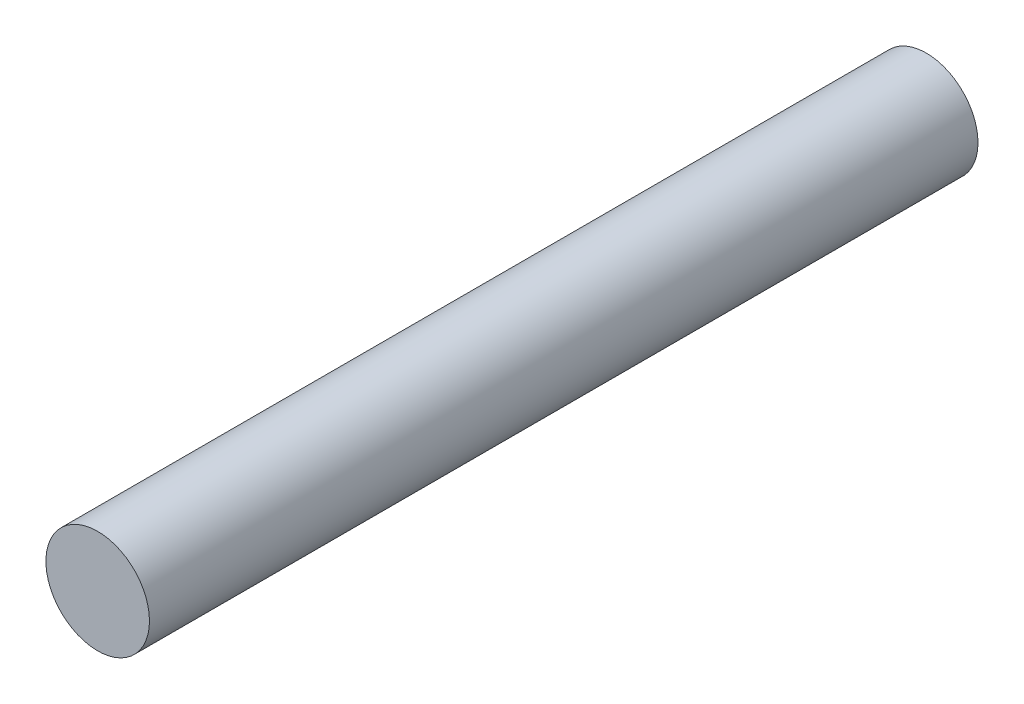
ISO-10303-21;
HEADER;
FILE_DESCRIPTION(('STEP AP214'),'2;1');
FILE_NAME('part.step','',(''),(''),'','','');
FILE_SCHEMA(('AUTOMOTIVE_DESIGN { 1 0 10303 214 1 1 1 1 }'));
ENDSEC;
DATA;
#1=APPLICATION_CONTEXT('core data for automotive mechanical design processes');
#2=APPLICATION_PROTOCOL_DEFINITION('international standard','automotive_design',2000,#1);
#3=PRODUCT_CONTEXT('',#1,'mechanical');
#4=PRODUCT('Part','Part','',(#3));
#5=PRODUCT_RELATED_PRODUCT_CATEGORY('part','',(#4));
#6=PRODUCT_DEFINITION_FORMATION('','',#4);
#7=PRODUCT_DEFINITION_CONTEXT('part definition',#1,'design');
#8=PRODUCT_DEFINITION('design','',#6,#7);
#9=PRODUCT_DEFINITION_SHAPE('','',#8);
#10=(LENGTH_UNIT() NAMED_UNIT(*) SI_UNIT(.MILLI.,.METRE.));
#11=(NAMED_UNIT(*) PLANE_ANGLE_UNIT() SI_UNIT($,.RADIAN.));
#12=(NAMED_UNIT(*) SI_UNIT($,.STERADIAN.) SOLID_ANGLE_UNIT());
#13=UNCERTAINTY_MEASURE_WITH_UNIT(LENGTH_MEASURE(1.E-05),#10,'distance_accuracy_value','');
#14=(GEOMETRIC_REPRESENTATION_CONTEXT(3) GLOBAL_UNCERTAINTY_ASSIGNED_CONTEXT((#13)) GLOBAL_UNIT_ASSIGNED_CONTEXT((#10,
#11,#12)) REPRESENTATION_CONTEXT('',''));
#15=CARTESIAN_POINT('',(0.,0.,0.));
#16=DIRECTION('',(0.,0.,1.));
#17=DIRECTION('',(1.,0.,0.));
#18=AXIS2_PLACEMENT_3D('',#15,#16,#17);
#19=CARTESIAN_POINT('',(0.,0.,40.));
#20=DIRECTION('',(0.,0.,-1.));
#21=DIRECTION('',(-1.,0.,0.));
#22=AXIS2_PLACEMENT_3D('',#19,#20,#21);
#23=CYLINDRICAL_SURFACE('',#22,2.5);
#24=CARTESIAN_POINT('',(0.,0.,40.));
#25=DIRECTION('',(0.,0.,1.));
#26=DIRECTION('',(1.,0.,0.));
#27=AXIS2_PLACEMENT_3D('',#24,#25,#26);
#28=CIRCLE('',#27,2.5);
#29=CARTESIAN_POINT('',(2.5,0.,40.));
#30=VERTEX_POINT('',#29);
#31=EDGE_CURVE('E10',#30,#30,#28,.T.);
#32=ORIENTED_EDGE('',*,*,#31,.F.);
#33=EDGE_LOOP('',(#32));
#34=FACE_BOUND('',#33,.T.);
#35=CARTESIAN_POINT('',(0.,0.,0.));
#36=DIRECTION('',(0.,0.,1.));
#37=DIRECTION('',(1.,0.,0.));
#38=AXIS2_PLACEMENT_3D('',#35,#36,#37);
#39=CIRCLE('',#38,2.5);
#40=CARTESIAN_POINT('',(2.5,0.,0.));
#41=VERTEX_POINT('',#40);
#42=EDGE_CURVE('E40',#41,#41,#39,.T.);
#43=ORIENTED_EDGE('',*,*,#42,.T.);
#44=EDGE_LOOP('',(#43));
#45=FACE_BOUND('',#44,.T.);
#46=ADVANCED_FACE('F37',(#34,#45),#23,.T.);
#47=CARTESIAN_POINT('',(0.,0.,40.));
#48=DIRECTION('',(0.,0.,1.));
#49=DIRECTION('',(1.,0.,0.));
#50=AXIS2_PLACEMENT_3D('',#47,#48,#49);
#51=PLANE('',#50);
#52=ORIENTED_EDGE('',*,*,#31,.T.);
#53=EDGE_LOOP('',(#52));
#54=FACE_BOUND('',#53,.T.);
#55=ADVANCED_FACE('F52',(#54),#51,.T.);
#56=CARTESIAN_POINT('',(0.,0.,0.));
#57=DIRECTION('',(0.,0.,1.));
#58=DIRECTION('',(1.,0.,0.));
#59=AXIS2_PLACEMENT_3D('',#56,#57,#58);
#60=PLANE('',#59);
#61=ORIENTED_EDGE('',*,*,#42,.F.);
#62=EDGE_LOOP('',(#61));
#63=FACE_BOUND('',#62,.T.);
#64=ADVANCED_FACE('F50',(#63),#60,.F.);
#65=CLOSED_SHELL('',(#46,#55,#64));
#66=MANIFOLD_SOLID_BREP('B2',#65);
#67=ADVANCED_BREP_SHAPE_REPRESENTATION('',(#18,#66),#14);
#68=SHAPE_DEFINITION_REPRESENTATION(#9,#67);
ENDSEC;
END-ISO-10303-21;
